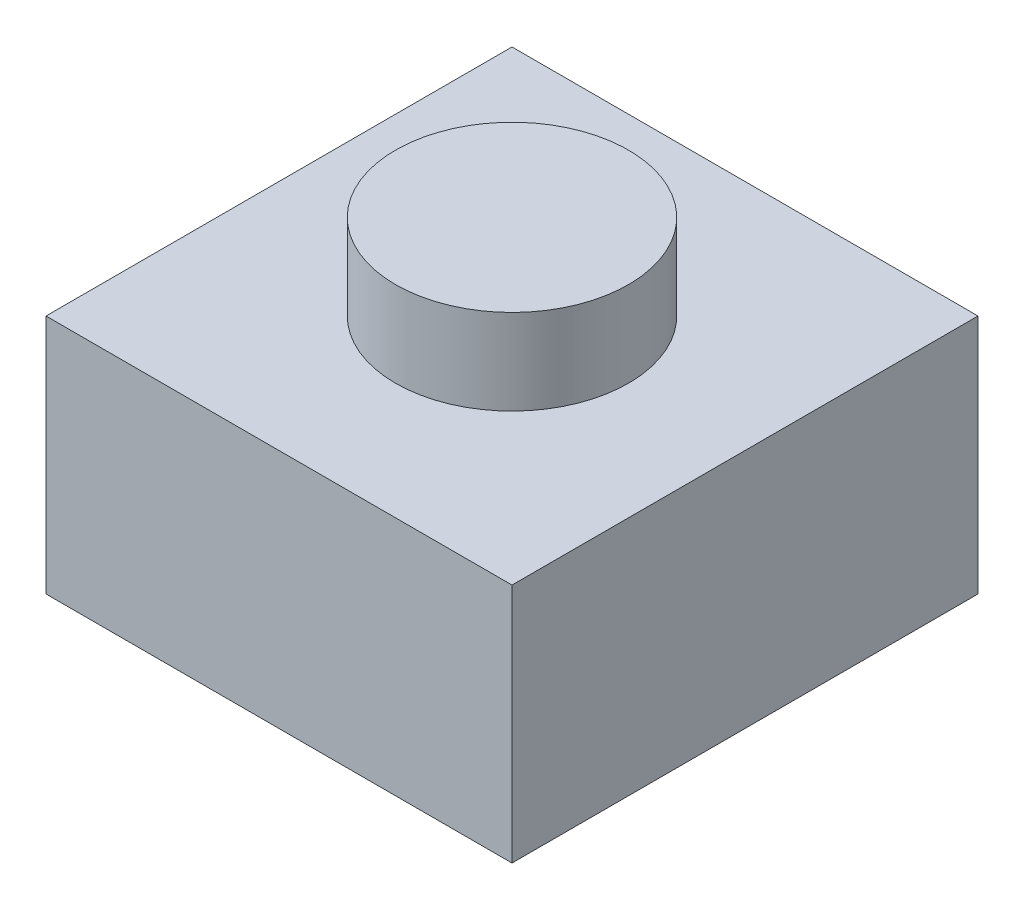
ISO-10303-21;
HEADER;
FILE_DESCRIPTION(('STEP AP214'),'2;1');
FILE_NAME('part.step','',(''),(''),'','','');
FILE_SCHEMA(('AUTOMOTIVE_DESIGN { 1 0 10303 214 1 1 1 1 }'));
ENDSEC;
DATA;
#1=APPLICATION_CONTEXT('core data for automotive mechanical design processes');
#2=APPLICATION_PROTOCOL_DEFINITION('international standard','automotive_design',2000,#1);
#3=PRODUCT_CONTEXT('',#1,'mechanical');
#4=PRODUCT('Part','Part','',(#3));
#5=PRODUCT_RELATED_PRODUCT_CATEGORY('part','',(#4));
#6=PRODUCT_DEFINITION_FORMATION('','',#4);
#7=PRODUCT_DEFINITION_CONTEXT('part definition',#1,'design');
#8=PRODUCT_DEFINITION('design','',#6,#7);
#9=PRODUCT_DEFINITION_SHAPE('','',#8);
#10=(LENGTH_UNIT() NAMED_UNIT(*) SI_UNIT(.MILLI.,.METRE.));
#11=(NAMED_UNIT(*) PLANE_ANGLE_UNIT() SI_UNIT($,.RADIAN.));
#12=(NAMED_UNIT(*) SI_UNIT($,.STERADIAN.) SOLID_ANGLE_UNIT());
#13=UNCERTAINTY_MEASURE_WITH_UNIT(LENGTH_MEASURE(1.E-05),#10,'distance_accuracy_value','');
#14=(GEOMETRIC_REPRESENTATION_CONTEXT(3) GLOBAL_UNCERTAINTY_ASSIGNED_CONTEXT((#13)) GLOBAL_UNIT_ASSIGNED_CONTEXT((#10,
#11,#12)) REPRESENTATION_CONTEXT('',''));
#15=CARTESIAN_POINT('',(0.,0.,0.));
#16=DIRECTION('',(0.,0.,1.));
#17=DIRECTION('',(1.,0.,0.));
#18=AXIS2_PLACEMENT_3D('',#15,#16,#17);
#19=CARTESIAN_POINT('',(-3.,3.1,2.99999999999999));
#20=DIRECTION('',(0.,1.,0.));
#21=DIRECTION('',(0.,0.,1.));
#22=AXIS2_PLACEMENT_3D('',#19,#20,#21);
#23=PLANE('',#22);
#24=DIRECTION('',(0.,0.,1.));
#25=VECTOR('',#24,1.);
#26=CARTESIAN_POINT('',(-3.,3.1,-3.00000000000001));
#27=LINE('',#26,#25);
#28=CARTESIAN_POINT('',(-3.,3.1,-3.00000000000001));
#29=VERTEX_POINT('',#28);
#30=CARTESIAN_POINT('',(-3.,3.1,2.99999999999999));
#31=VERTEX_POINT('',#30);
#32=EDGE_CURVE('E86',#29,#31,#27,.T.);
#33=ORIENTED_EDGE('',*,*,#32,.T.);
#34=DIRECTION('',(1.,0.,0.));
#35=VECTOR('',#34,1.);
#36=CARTESIAN_POINT('',(-3.,3.1,2.99999999999999));
#37=LINE('',#36,#35);
#38=CARTESIAN_POINT('',(3.00000000000002,3.1,2.99999999999999));
#39=VERTEX_POINT('',#38);
#40=EDGE_CURVE('E81',#31,#39,#37,.T.);
#41=ORIENTED_EDGE('',*,*,#40,.T.);
#42=DIRECTION('',(0.,0.,-1.));
#43=VECTOR('',#42,1.);
#44=CARTESIAN_POINT('',(3.,3.1,-3.00000000000001));
#45=LINE('',#44,#43);
#46=CARTESIAN_POINT('',(3.,3.1,-3.00000000000001));
#47=VERTEX_POINT('',#46);
#48=EDGE_CURVE('E84',#39,#47,#45,.T.);
#49=ORIENTED_EDGE('',*,*,#48,.T.);
#50=DIRECTION('',(-1.,0.,0.));
#51=VECTOR('',#50,1.);
#52=CARTESIAN_POINT('',(-3.,3.1,-3.00000000000001));
#53=LINE('',#52,#51);
#54=EDGE_CURVE('E51',#47,#29,#53,.T.);
#55=ORIENTED_EDGE('',*,*,#54,.T.);
#56=EDGE_LOOP('',(#33,#41,#49,#55));
#57=FACE_BOUND('',#56,.T.);
#58=CARTESIAN_POINT('',(0.,3.1,0.));
#59=DIRECTION('',(0.,1.,0.));
#60=DIRECTION('',(0.,0.,1.));
#61=AXIS2_PLACEMENT_3D('',#58,#59,#60);
#62=CIRCLE('',#61,1.5);
#63=CARTESIAN_POINT('',(0.,3.1,1.5));
#64=VERTEX_POINT('',#63);
#65=EDGE_CURVE('E114',#64,#64,#62,.T.);
#66=ORIENTED_EDGE('',*,*,#65,.F.);
#67=EDGE_LOOP('',(#66));
#68=FACE_BOUND('',#67,.T.);
#69=ADVANCED_FACE('F34',(#57,#68),#23,.T.);
#70=CARTESIAN_POINT('',(-3.,3.1,-3.00000000000001));
#71=DIRECTION('',(1.,0.,0.));
#72=DIRECTION('',(0.,0.,-1.));
#73=AXIS2_PLACEMENT_3D('',#70,#71,#72);
#74=PLANE('',#73);
#75=DIRECTION('',(0.,0.,1.));
#76=VECTOR('',#75,1.);
#77=CARTESIAN_POINT('',(-3.,0.,-3.00000000000001));
#78=LINE('',#77,#76);
#79=CARTESIAN_POINT('',(-3.,0.,-3.00000000000001));
#80=VERTEX_POINT('',#79);
#81=CARTESIAN_POINT('',(-3.,0.,2.99999999999999));
#82=VERTEX_POINT('',#81);
#83=EDGE_CURVE('E98',#80,#82,#78,.T.);
#84=ORIENTED_EDGE('',*,*,#83,.T.);
#85=DIRECTION('',(0.,-1.,0.));
#86=VECTOR('',#85,1.);
#87=CARTESIAN_POINT('',(-3.,3.1,2.99999999999999));
#88=LINE('',#87,#86);
#89=EDGE_CURVE('E12',#31,#82,#88,.T.);
#90=ORIENTED_EDGE('',*,*,#89,.F.);
#91=ORIENTED_EDGE('',*,*,#32,.F.);
#92=DIRECTION('',(0.,-1.,0.));
#93=VECTOR('',#92,1.);
#94=CARTESIAN_POINT('',(-3.,3.1,-3.00000000000001));
#95=LINE('',#94,#93);
#96=EDGE_CURVE('E94',#29,#80,#95,.T.);
#97=ORIENTED_EDGE('',*,*,#96,.T.);
#98=EDGE_LOOP('',(#84,#90,#91,#97));
#99=FACE_BOUND('',#98,.T.);
#100=ADVANCED_FACE('F36',(#99),#74,.F.);
#101=CARTESIAN_POINT('',(-3.,3.1,2.99999999999999));
#102=DIRECTION('',(0.,0.,-1.));
#103=DIRECTION('',(-1.,0.,0.));
#104=AXIS2_PLACEMENT_3D('',#101,#102,#103);
#105=PLANE('',#104);
#106=DIRECTION('',(1.,0.,0.));
#107=VECTOR('',#106,1.);
#108=CARTESIAN_POINT('',(-3.,0.,2.99999999999999));
#109=LINE('',#108,#107);
#110=CARTESIAN_POINT('',(3.00000000000002,0.,2.99999999999999));
#111=VERTEX_POINT('',#110);
#112=EDGE_CURVE('E90',#82,#111,#109,.T.);
#113=ORIENTED_EDGE('',*,*,#112,.T.);
#114=DIRECTION('',(0.,-1.,0.));
#115=VECTOR('',#114,1.);
#116=CARTESIAN_POINT('',(3.00000000000002,3.1,2.99999999999999));
#117=LINE('',#116,#115);
#118=EDGE_CURVE('E43',#39,#111,#117,.T.);
#119=ORIENTED_EDGE('',*,*,#118,.F.);
#120=ORIENTED_EDGE('',*,*,#40,.F.);
#121=ORIENTED_EDGE('',*,*,#89,.T.);
#122=EDGE_LOOP('',(#113,#119,#120,#121));
#123=FACE_BOUND('',#122,.T.);
#124=ADVANCED_FACE('F89',(#123),#105,.F.);
#125=CARTESIAN_POINT('',(3.,3.1,-3.00000000000001));
#126=DIRECTION('',(-1.,0.,0.));
#127=DIRECTION('',(0.,0.,1.));
#128=AXIS2_PLACEMENT_3D('',#125,#126,#127);
#129=PLANE('',#128);
#130=DIRECTION('',(0.,0.,-1.));
#131=VECTOR('',#130,1.);
#132=CARTESIAN_POINT('',(3.,0.,-3.00000000000001));
#133=LINE('',#132,#131);
#134=CARTESIAN_POINT('',(3.,0.,-3.00000000000001));
#135=VERTEX_POINT('',#134);
#136=EDGE_CURVE('E68',#111,#135,#133,.T.);
#137=ORIENTED_EDGE('',*,*,#136,.T.);
#138=DIRECTION('',(0.,-1.,0.));
#139=VECTOR('',#138,1.);
#140=CARTESIAN_POINT('',(3.,3.1,-3.00000000000001));
#141=LINE('',#140,#139);
#142=EDGE_CURVE('E91',#47,#135,#141,.T.);
#143=ORIENTED_EDGE('',*,*,#142,.F.);
#144=ORIENTED_EDGE('',*,*,#48,.F.);
#145=ORIENTED_EDGE('',*,*,#118,.T.);
#146=EDGE_LOOP('',(#137,#143,#144,#145));
#147=FACE_BOUND('',#146,.T.);
#148=ADVANCED_FACE('F92',(#147),#129,.F.);
#149=CARTESIAN_POINT('',(-3.,3.1,-3.00000000000001));
#150=DIRECTION('',(0.,0.,1.));
#151=DIRECTION('',(1.,0.,0.));
#152=AXIS2_PLACEMENT_3D('',#149,#150,#151);
#153=PLANE('',#152);
#154=DIRECTION('',(-1.,0.,0.));
#155=VECTOR('',#154,1.);
#156=CARTESIAN_POINT('',(-3.,0.,-3.00000000000001));
#157=LINE('',#156,#155);
#158=EDGE_CURVE('E74',#135,#80,#157,.T.);
#159=ORIENTED_EDGE('',*,*,#158,.T.);
#160=ORIENTED_EDGE('',*,*,#96,.F.);
#161=ORIENTED_EDGE('',*,*,#54,.F.);
#162=ORIENTED_EDGE('',*,*,#142,.T.);
#163=EDGE_LOOP('',(#159,#160,#161,#162));
#164=FACE_BOUND('',#163,.T.);
#165=ADVANCED_FACE('F106',(#164),#153,.F.);
#166=CARTESIAN_POINT('',(-3.,0.,2.99999999999999));
#167=DIRECTION('',(0.,1.,0.));
#168=DIRECTION('',(0.,0.,1.));
#169=AXIS2_PLACEMENT_3D('',#166,#167,#168);
#170=PLANE('',#169);
#171=ORIENTED_EDGE('',*,*,#83,.F.);
#172=ORIENTED_EDGE('',*,*,#158,.F.);
#173=ORIENTED_EDGE('',*,*,#136,.F.);
#174=ORIENTED_EDGE('',*,*,#112,.F.);
#175=EDGE_LOOP('',(#171,#172,#173,#174));
#176=FACE_BOUND('',#175,.T.);
#177=ADVANCED_FACE('F109',(#176),#170,.F.);
#178=CARTESIAN_POINT('',(0.,12.6426406871193,0.));
#179=DIRECTION('',(0.,-1.,0.));
#180=DIRECTION('',(0.,0.,-1.));
#181=AXIS2_PLACEMENT_3D('',#178,#179,#180);
#182=CYLINDRICAL_SURFACE('',#181,1.5);
#183=ORIENTED_EDGE('',*,*,#65,.T.);
#184=EDGE_LOOP('',(#183));
#185=FACE_BOUND('',#184,.T.);
#186=CARTESIAN_POINT('',(0.,4.2,0.));
#187=DIRECTION('',(0.,1.,0.));
#188=DIRECTION('',(0.,0.,1.));
#189=AXIS2_PLACEMENT_3D('',#186,#187,#188);
#190=CIRCLE('',#189,1.5);
#191=CARTESIAN_POINT('',(0.,4.2,1.5));
#192=VERTEX_POINT('',#191);
#193=EDGE_CURVE('E101',#192,#192,#190,.T.);
#194=ORIENTED_EDGE('',*,*,#193,.F.);
#195=EDGE_LOOP('',(#194));
#196=FACE_BOUND('',#195,.T.);
#197=ADVANCED_FACE('F118',(#185,#196),#182,.T.);
#198=CARTESIAN_POINT('',(-3.,4.2,2.99999999999999));
#199=DIRECTION('',(0.,1.,0.));
#200=DIRECTION('',(0.,0.,1.));
#201=AXIS2_PLACEMENT_3D('',#198,#199,#200);
#202=PLANE('',#201);
#203=ORIENTED_EDGE('',*,*,#193,.T.);
#204=EDGE_LOOP('',(#203));
#205=FACE_BOUND('',#204,.T.);
#206=ADVANCED_FACE('F127',(#205),#202,.T.);
#207=CLOSED_SHELL('',(#69,#100,#124,#148,#165,#177,#197,#206));
#208=MANIFOLD_SOLID_BREP('B2',#207);
#209=ADVANCED_BREP_SHAPE_REPRESENTATION('',(#18,#208),#14);
#210=SHAPE_DEFINITION_REPRESENTATION(#9,#209);
ENDSEC;
END-ISO-10303-21;
